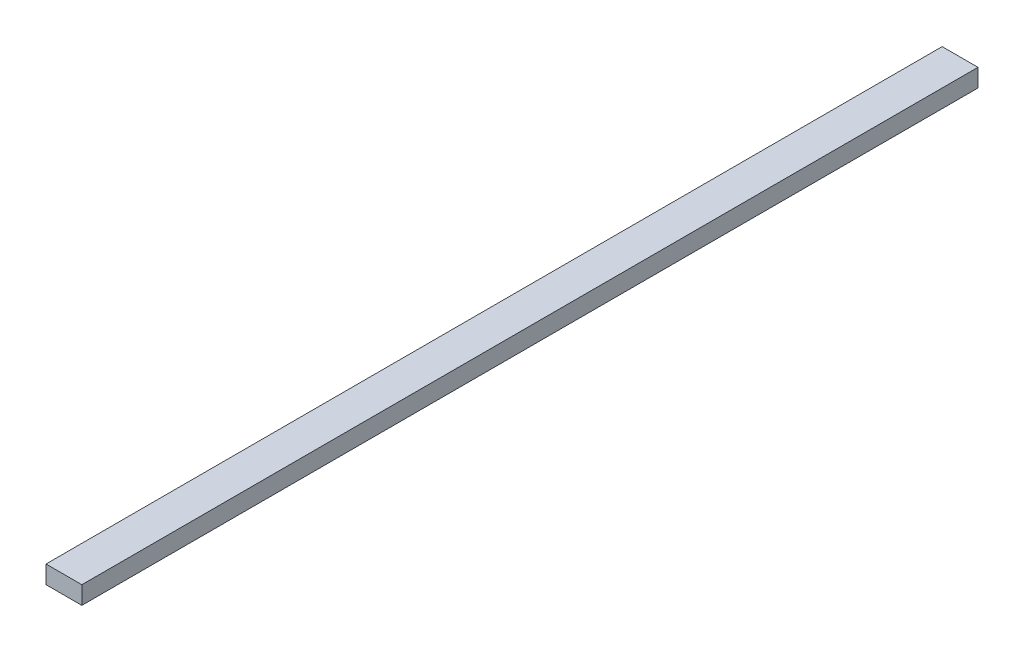
ISO-10303-21;
HEADER;
FILE_DESCRIPTION(('STEP AP214'),'2;1');
FILE_NAME('part.step','',(''),(''),'','','');
FILE_SCHEMA(('AUTOMOTIVE_DESIGN { 1 0 10303 214 1 1 1 1 }'));
ENDSEC;
DATA;
#1=APPLICATION_CONTEXT('core data for automotive mechanical design processes');
#2=APPLICATION_PROTOCOL_DEFINITION('international standard','automotive_design',2000,#1);
#3=PRODUCT_CONTEXT('',#1,'mechanical');
#4=PRODUCT('Part','Part','',(#3));
#5=PRODUCT_RELATED_PRODUCT_CATEGORY('part','',(#4));
#6=PRODUCT_DEFINITION_FORMATION('','',#4);
#7=PRODUCT_DEFINITION_CONTEXT('part definition',#1,'design');
#8=PRODUCT_DEFINITION('design','',#6,#7);
#9=PRODUCT_DEFINITION_SHAPE('','',#8);
#10=(LENGTH_UNIT() NAMED_UNIT(*) SI_UNIT(.MILLI.,.METRE.));
#11=(NAMED_UNIT(*) PLANE_ANGLE_UNIT() SI_UNIT($,.RADIAN.));
#12=(NAMED_UNIT(*) SI_UNIT($,.STERADIAN.) SOLID_ANGLE_UNIT());
#13=UNCERTAINTY_MEASURE_WITH_UNIT(LENGTH_MEASURE(1.E-05),#10,'distance_accuracy_value','');
#14=(GEOMETRIC_REPRESENTATION_CONTEXT(3) GLOBAL_UNCERTAINTY_ASSIGNED_CONTEXT((#13)) GLOBAL_UNIT_ASSIGNED_CONTEXT((#10,
#11,#12)) REPRESENTATION_CONTEXT('',''));
#15=CARTESIAN_POINT('',(0.,0.,0.));
#16=DIRECTION('',(0.,0.,1.));
#17=DIRECTION('',(1.,0.,0.));
#18=AXIS2_PLACEMENT_3D('',#15,#16,#17);
#19=CARTESIAN_POINT('',(10.,5.,500.));
#20=DIRECTION('',(-1.,0.,0.));
#21=DIRECTION('',(0.,0.,1.));
#22=AXIS2_PLACEMENT_3D('',#19,#20,#21);
#23=PLANE('',#22);
#24=DIRECTION('',(0.,1.,0.));
#25=VECTOR('',#24,1.);
#26=CARTESIAN_POINT('',(10.,5.,0.));
#27=LINE('',#26,#25);
#28=CARTESIAN_POINT('',(10.,-5.,0.));
#29=VERTEX_POINT('',#28);
#30=CARTESIAN_POINT('',(10.,5.,0.));
#31=VERTEX_POINT('',#30);
#32=EDGE_CURVE('E102',#29,#31,#27,.T.);
#33=ORIENTED_EDGE('',*,*,#32,.T.);
#34=DIRECTION('',(0.,0.,-1.));
#35=VECTOR('',#34,1.);
#36=CARTESIAN_POINT('',(10.,5.,500.));
#37=LINE('',#36,#35);
#38=CARTESIAN_POINT('',(10.,5.,500.));
#39=VERTEX_POINT('',#38);
#40=EDGE_CURVE('E11',#39,#31,#37,.T.);
#41=ORIENTED_EDGE('',*,*,#40,.F.);
#42=DIRECTION('',(0.,1.,0.));
#43=VECTOR('',#42,1.);
#44=CARTESIAN_POINT('',(10.,5.,500.));
#45=LINE('',#44,#43);
#46=CARTESIAN_POINT('',(10.,-5.,500.));
#47=VERTEX_POINT('',#46);
#48=EDGE_CURVE('E90',#47,#39,#45,.T.);
#49=ORIENTED_EDGE('',*,*,#48,.F.);
#50=DIRECTION('',(0.,0.,-1.));
#51=VECTOR('',#50,1.);
#52=CARTESIAN_POINT('',(10.,-5.,500.));
#53=LINE('',#52,#51);
#54=EDGE_CURVE('E98',#47,#29,#53,.T.);
#55=ORIENTED_EDGE('',*,*,#54,.T.);
#56=EDGE_LOOP('',(#33,#41,#49,#55));
#57=FACE_BOUND('',#56,.T.);
#58=ADVANCED_FACE('F39',(#57),#23,.F.);
#59=CARTESIAN_POINT('',(-10.,5.,500.));
#60=DIRECTION('',(0.,-1.,0.));
#61=DIRECTION('',(0.,0.,-1.));
#62=AXIS2_PLACEMENT_3D('',#59,#60,#61);
#63=PLANE('',#62);
#64=DIRECTION('',(-1.,0.,0.));
#65=VECTOR('',#64,1.);
#66=CARTESIAN_POINT('',(-10.,5.,0.));
#67=LINE('',#66,#65);
#68=CARTESIAN_POINT('',(-10.,5.,0.));
#69=VERTEX_POINT('',#68);
#70=EDGE_CURVE('E94',#31,#69,#67,.T.);
#71=ORIENTED_EDGE('',*,*,#70,.T.);
#72=DIRECTION('',(0.,0.,-1.));
#73=VECTOR('',#72,1.);
#74=CARTESIAN_POINT('',(-10.,5.,500.));
#75=LINE('',#74,#73);
#76=CARTESIAN_POINT('',(-10.,5.,500.));
#77=VERTEX_POINT('',#76);
#78=EDGE_CURVE('E47',#77,#69,#75,.T.);
#79=ORIENTED_EDGE('',*,*,#78,.F.);
#80=DIRECTION('',(-1.,0.,0.));
#81=VECTOR('',#80,1.);
#82=CARTESIAN_POINT('',(-10.,5.,500.));
#83=LINE('',#82,#81);
#84=EDGE_CURVE('E85',#39,#77,#83,.T.);
#85=ORIENTED_EDGE('',*,*,#84,.F.);
#86=ORIENTED_EDGE('',*,*,#40,.T.);
#87=EDGE_LOOP('',(#71,#79,#85,#86));
#88=FACE_BOUND('',#87,.T.);
#89=ADVANCED_FACE('F93',(#88),#63,.F.);
#90=CARTESIAN_POINT('',(-10.,5.,500.));
#91=DIRECTION('',(1.,0.,0.));
#92=DIRECTION('',(0.,1.,0.));
#93=AXIS2_PLACEMENT_3D('',#90,#91,#92);
#94=PLANE('',#93);
#95=DIRECTION('',(0.,-1.,0.));
#96=VECTOR('',#95,1.);
#97=CARTESIAN_POINT('',(-10.,5.,0.));
#98=LINE('',#97,#96);
#99=CARTESIAN_POINT('',(-10.,-5.,0.));
#100=VERTEX_POINT('',#99);
#101=EDGE_CURVE('E72',#69,#100,#98,.T.);
#102=ORIENTED_EDGE('',*,*,#101,.T.);
#103=DIRECTION('',(0.,0.,-1.));
#104=VECTOR('',#103,1.);
#105=CARTESIAN_POINT('',(-10.,-5.,500.));
#106=LINE('',#105,#104);
#107=CARTESIAN_POINT('',(-10.,-5.,500.));
#108=VERTEX_POINT('',#107);
#109=EDGE_CURVE('E95',#108,#100,#106,.T.);
#110=ORIENTED_EDGE('',*,*,#109,.F.);
#111=DIRECTION('',(0.,-1.,0.));
#112=VECTOR('',#111,1.);
#113=CARTESIAN_POINT('',(-10.,5.,500.));
#114=LINE('',#113,#112);
#115=EDGE_CURVE('E88',#77,#108,#114,.T.);
#116=ORIENTED_EDGE('',*,*,#115,.F.);
#117=ORIENTED_EDGE('',*,*,#78,.T.);
#118=EDGE_LOOP('',(#102,#110,#116,#117));
#119=FACE_BOUND('',#118,.T.);
#120=ADVANCED_FACE('F96',(#119),#94,.F.);
#121=CARTESIAN_POINT('',(-10.,-5.,500.));
#122=DIRECTION('',(0.,1.,0.));
#123=DIRECTION('',(0.,0.,1.));
#124=AXIS2_PLACEMENT_3D('',#121,#122,#123);
#125=PLANE('',#124);
#126=DIRECTION('',(1.,0.,0.));
#127=VECTOR('',#126,1.);
#128=CARTESIAN_POINT('',(-10.,-5.,0.));
#129=LINE('',#128,#127);
#130=EDGE_CURVE('E78',#100,#29,#129,.T.);
#131=ORIENTED_EDGE('',*,*,#130,.T.);
#132=ORIENTED_EDGE('',*,*,#54,.F.);
#133=DIRECTION('',(1.,0.,0.));
#134=VECTOR('',#133,1.);
#135=CARTESIAN_POINT('',(-10.,-5.,500.));
#136=LINE('',#135,#134);
#137=EDGE_CURVE('E55',#108,#47,#136,.T.);
#138=ORIENTED_EDGE('',*,*,#137,.F.);
#139=ORIENTED_EDGE('',*,*,#109,.T.);
#140=EDGE_LOOP('',(#131,#132,#138,#139));
#141=FACE_BOUND('',#140,.T.);
#142=ADVANCED_FACE('F109',(#141),#125,.F.);
#143=CARTESIAN_POINT('',(0.,0.,500.));
#144=DIRECTION('',(0.,0.,1.));
#145=DIRECTION('',(1.,0.,0.));
#146=AXIS2_PLACEMENT_3D('',#143,#144,#145);
#147=PLANE('',#146);
#148=ORIENTED_EDGE('',*,*,#48,.T.);
#149=ORIENTED_EDGE('',*,*,#84,.T.);
#150=ORIENTED_EDGE('',*,*,#115,.T.);
#151=ORIENTED_EDGE('',*,*,#137,.T.);
#152=EDGE_LOOP('',(#148,#149,#150,#151));
#153=FACE_BOUND('',#152,.T.);
#154=ADVANCED_FACE('F86',(#153),#147,.T.);
#155=CARTESIAN_POINT('',(0.,0.,0.));
#156=DIRECTION('',(0.,0.,1.));
#157=DIRECTION('',(1.,0.,0.));
#158=AXIS2_PLACEMENT_3D('',#155,#156,#157);
#159=PLANE('',#158);
#160=ORIENTED_EDGE('',*,*,#32,.F.);
#161=ORIENTED_EDGE('',*,*,#130,.F.);
#162=ORIENTED_EDGE('',*,*,#101,.F.);
#163=ORIENTED_EDGE('',*,*,#70,.F.);
#164=EDGE_LOOP('',(#160,#161,#162,#163));
#165=FACE_BOUND('',#164,.T.);
#166=ADVANCED_FACE('F112',(#165),#159,.F.);
#167=CLOSED_SHELL('',(#58,#89,#120,#142,#154,#166));
#168=MANIFOLD_SOLID_BREP('B2',#167);
#169=ADVANCED_BREP_SHAPE_REPRESENTATION('',(#18,#168),#14);
#170=SHAPE_DEFINITION_REPRESENTATION(#9,#169);
ENDSEC;
END-ISO-10303-21;
